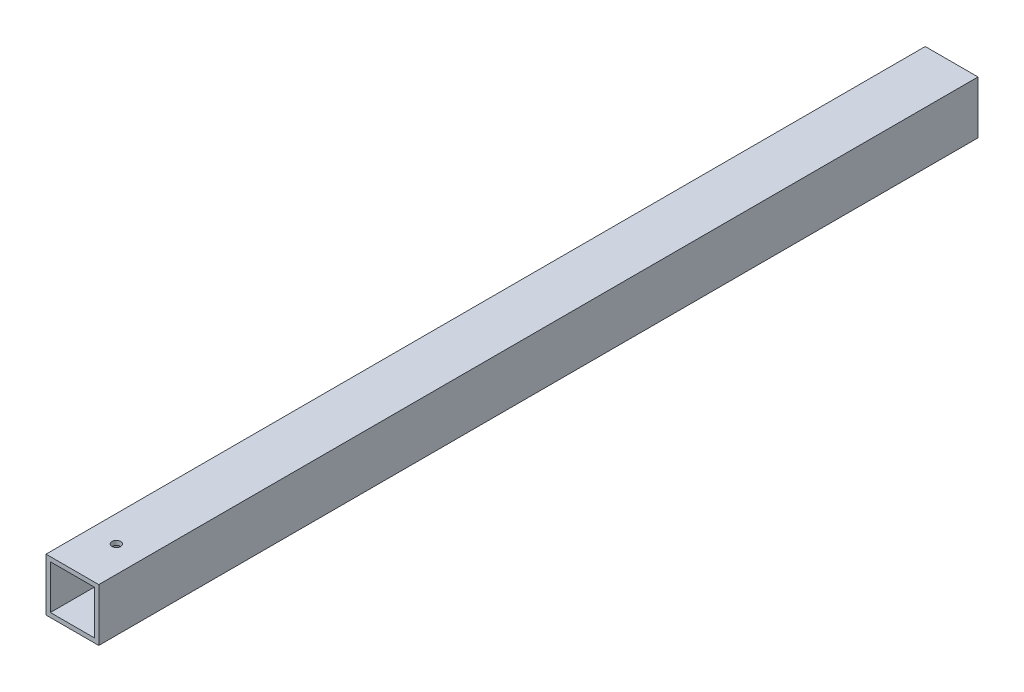
ISO-10303-21;
HEADER;
FILE_DESCRIPTION(('STEP AP214'),'2;1');
FILE_NAME('part.step','',(''),(''),'','','');
FILE_SCHEMA(('AUTOMOTIVE_DESIGN { 1 0 10303 214 1 1 1 1 }'));
ENDSEC;
DATA;
#1=APPLICATION_CONTEXT('core data for automotive mechanical design processes');
#2=APPLICATION_PROTOCOL_DEFINITION('international standard','automotive_design',2000,#1);
#3=PRODUCT_CONTEXT('',#1,'mechanical');
#4=PRODUCT('Part','Part','',(#3));
#5=PRODUCT_RELATED_PRODUCT_CATEGORY('part','',(#4));
#6=PRODUCT_DEFINITION_FORMATION('','',#4);
#7=PRODUCT_DEFINITION_CONTEXT('part definition',#1,'design');
#8=PRODUCT_DEFINITION('design','',#6,#7);
#9=PRODUCT_DEFINITION_SHAPE('','',#8);
#10=(LENGTH_UNIT() NAMED_UNIT(*) SI_UNIT(.MILLI.,.METRE.));
#11=(NAMED_UNIT(*) PLANE_ANGLE_UNIT() SI_UNIT($,.RADIAN.));
#12=(NAMED_UNIT(*) SI_UNIT($,.STERADIAN.) SOLID_ANGLE_UNIT());
#13=UNCERTAINTY_MEASURE_WITH_UNIT(LENGTH_MEASURE(1.E-05),#10,'distance_accuracy_value','');
#14=(GEOMETRIC_REPRESENTATION_CONTEXT(3) GLOBAL_UNCERTAINTY_ASSIGNED_CONTEXT((#13)) GLOBAL_UNIT_ASSIGNED_CONTEXT((#10,
#11,#12)) REPRESENTATION_CONTEXT('',''));
#15=CARTESIAN_POINT('',(0.,0.,0.));
#16=DIRECTION('',(0.,0.,1.));
#17=DIRECTION('',(1.,0.,0.));
#18=AXIS2_PLACEMENT_3D('',#15,#16,#17);
#19=CARTESIAN_POINT('',(0.,0.,200.));
#20=DIRECTION('',(0.,0.,-1.));
#21=DIRECTION('',(-1.,0.,0.));
#22=AXIS2_PLACEMENT_3D('',#19,#20,#21);
#23=PLANE('',#22);
#24=DIRECTION('',(0.,-1.,0.));
#25=VECTOR('',#24,1.);
#26=CARTESIAN_POINT('',(0.,0.,200.));
#27=LINE('',#26,#25);
#28=CARTESIAN_POINT('',(0.,12.,200.));
#29=VERTEX_POINT('',#28);
#30=CARTESIAN_POINT('',(0.,0.,200.));
#31=VERTEX_POINT('',#30);
#32=EDGE_CURVE('E156',#29,#31,#27,.T.);
#33=ORIENTED_EDGE('',*,*,#32,.T.);
#34=DIRECTION('',(1.,0.,0.));
#35=VECTOR('',#34,1.);
#36=CARTESIAN_POINT('',(0.,0.,200.));
#37=LINE('',#36,#35);
#38=CARTESIAN_POINT('',(12.,0.,200.));
#39=VERTEX_POINT('',#38);
#40=EDGE_CURVE('E160',#31,#39,#37,.T.);
#41=ORIENTED_EDGE('',*,*,#40,.T.);
#42=DIRECTION('',(0.,1.,0.));
#43=VECTOR('',#42,1.);
#44=CARTESIAN_POINT('',(12.,0.,200.));
#45=LINE('',#44,#43);
#46=CARTESIAN_POINT('',(12.,12.,200.));
#47=VERTEX_POINT('',#46);
#48=EDGE_CURVE('E164',#39,#47,#45,.T.);
#49=ORIENTED_EDGE('',*,*,#48,.T.);
#50=DIRECTION('',(-1.,0.,0.));
#51=VECTOR('',#50,1.);
#52=CARTESIAN_POINT('',(0.,12.,200.));
#53=LINE('',#52,#51);
#54=EDGE_CURVE('E167',#47,#29,#53,.T.);
#55=ORIENTED_EDGE('',*,*,#54,.T.);
#56=EDGE_LOOP('',(#33,#41,#49,#55));
#57=FACE_BOUND('',#56,.T.);
#58=DIRECTION('',(0.,-1.,0.));
#59=VECTOR('',#58,1.);
#60=CARTESIAN_POINT('',(1.,1.,200.));
#61=LINE('',#60,#59);
#62=CARTESIAN_POINT('',(1.,11.,200.));
#63=VERTEX_POINT('',#62);
#64=CARTESIAN_POINT('',(1.,1.,200.));
#65=VERTEX_POINT('',#64);
#66=EDGE_CURVE('E106',#63,#65,#61,.T.);
#67=ORIENTED_EDGE('',*,*,#66,.F.);
#68=DIRECTION('',(-1.,0.,0.));
#69=VECTOR('',#68,1.);
#70=CARTESIAN_POINT('',(1.,11.,200.));
#71=LINE('',#70,#69);
#72=CARTESIAN_POINT('',(11.,11.,200.));
#73=VERTEX_POINT('',#72);
#74=EDGE_CURVE('E132',#73,#63,#71,.T.);
#75=ORIENTED_EDGE('',*,*,#74,.F.);
#76=DIRECTION('',(0.,1.,0.));
#77=VECTOR('',#76,1.);
#78=CARTESIAN_POINT('',(11.,1.,200.));
#79=LINE('',#78,#77);
#80=CARTESIAN_POINT('',(11.,1.,200.));
#81=VERTEX_POINT('',#80);
#82=EDGE_CURVE('E128',#81,#73,#79,.T.);
#83=ORIENTED_EDGE('',*,*,#82,.F.);
#84=DIRECTION('',(1.,0.,0.));
#85=VECTOR('',#84,1.);
#86=CARTESIAN_POINT('',(1.,1.,200.));
#87=LINE('',#86,#85);
#88=EDGE_CURVE('E115',#65,#81,#87,.T.);
#89=ORIENTED_EDGE('',*,*,#88,.F.);
#90=EDGE_LOOP('',(#67,#75,#83,#89));
#91=FACE_BOUND('',#90,.T.);
#92=ADVANCED_FACE('F39',(#57,#91),#23,.F.);
#93=CARTESIAN_POINT('',(0.,0.,0.));
#94=DIRECTION('',(0.,0.,-1.));
#95=DIRECTION('',(-1.,0.,0.));
#96=AXIS2_PLACEMENT_3D('',#93,#94,#95);
#97=PLANE('',#96);
#98=DIRECTION('',(0.,-1.,0.));
#99=VECTOR('',#98,1.);
#100=CARTESIAN_POINT('',(0.,0.,0.));
#101=LINE('',#100,#99);
#102=CARTESIAN_POINT('',(0.,12.,0.));
#103=VERTEX_POINT('',#102);
#104=CARTESIAN_POINT('',(0.,0.,0.));
#105=VERTEX_POINT('',#104);
#106=EDGE_CURVE('E124',#103,#105,#101,.T.);
#107=ORIENTED_EDGE('',*,*,#106,.F.);
#108=DIRECTION('',(-1.,0.,0.));
#109=VECTOR('',#108,1.);
#110=CARTESIAN_POINT('',(0.,12.,0.));
#111=LINE('',#110,#109);
#112=CARTESIAN_POINT('',(12.,12.,0.));
#113=VERTEX_POINT('',#112);
#114=EDGE_CURVE('E161',#113,#103,#111,.T.);
#115=ORIENTED_EDGE('',*,*,#114,.F.);
#116=DIRECTION('',(0.,1.,0.));
#117=VECTOR('',#116,1.);
#118=CARTESIAN_POINT('',(12.,0.,0.));
#119=LINE('',#118,#117);
#120=CARTESIAN_POINT('',(12.,0.,0.));
#121=VERTEX_POINT('',#120);
#122=EDGE_CURVE('E177',#121,#113,#119,.T.);
#123=ORIENTED_EDGE('',*,*,#122,.F.);
#124=DIRECTION('',(1.,0.,0.));
#125=VECTOR('',#124,1.);
#126=CARTESIAN_POINT('',(0.,0.,0.));
#127=LINE('',#126,#125);
#128=EDGE_CURVE('E174',#105,#121,#127,.T.);
#129=ORIENTED_EDGE('',*,*,#128,.F.);
#130=EDGE_LOOP('',(#107,#115,#123,#129));
#131=FACE_BOUND('',#130,.T.);
#132=DIRECTION('',(-1.,0.,0.));
#133=VECTOR('',#132,1.);
#134=CARTESIAN_POINT('',(1.,11.,0.));
#135=LINE('',#134,#133);
#136=CARTESIAN_POINT('',(11.,11.,0.));
#137=VERTEX_POINT('',#136);
#138=CARTESIAN_POINT('',(1.,11.,0.));
#139=VERTEX_POINT('',#138);
#140=EDGE_CURVE('E116',#137,#139,#135,.T.);
#141=ORIENTED_EDGE('',*,*,#140,.T.);
#142=DIRECTION('',(0.,-1.,0.));
#143=VECTOR('',#142,1.);
#144=CARTESIAN_POINT('',(1.,1.,0.));
#145=LINE('',#144,#143);
#146=CARTESIAN_POINT('',(1.,1.,0.));
#147=VERTEX_POINT('',#146);
#148=EDGE_CURVE('E64',#139,#147,#145,.T.);
#149=ORIENTED_EDGE('',*,*,#148,.T.);
#150=DIRECTION('',(1.,0.,0.));
#151=VECTOR('',#150,1.);
#152=CARTESIAN_POINT('',(1.,1.,0.));
#153=LINE('',#152,#151);
#154=CARTESIAN_POINT('',(11.,1.,0.));
#155=VERTEX_POINT('',#154);
#156=EDGE_CURVE('E122',#147,#155,#153,.T.);
#157=ORIENTED_EDGE('',*,*,#156,.T.);
#158=DIRECTION('',(0.,1.,0.));
#159=VECTOR('',#158,1.);
#160=CARTESIAN_POINT('',(11.,1.,0.));
#161=LINE('',#160,#159);
#162=EDGE_CURVE('E143',#155,#137,#161,.T.);
#163=ORIENTED_EDGE('',*,*,#162,.T.);
#164=EDGE_LOOP('',(#141,#149,#157,#163));
#165=FACE_BOUND('',#164,.T.);
#166=ADVANCED_FACE('F201',(#131,#165),#97,.T.);
#167=CARTESIAN_POINT('',(0.,0.,200.));
#168=DIRECTION('',(1.,0.,0.));
#169=DIRECTION('',(0.,0.,-1.));
#170=AXIS2_PLACEMENT_3D('',#167,#168,#169);
#171=PLANE('',#170);
#172=ORIENTED_EDGE('',*,*,#106,.T.);
#173=DIRECTION('',(0.,0.,-1.));
#174=VECTOR('',#173,1.);
#175=CARTESIAN_POINT('',(0.,0.,200.));
#176=LINE('',#175,#174);
#177=EDGE_CURVE('E11',#31,#105,#176,.T.);
#178=ORIENTED_EDGE('',*,*,#177,.F.);
#179=ORIENTED_EDGE('',*,*,#32,.F.);
#180=DIRECTION('',(0.,0.,-1.));
#181=VECTOR('',#180,1.);
#182=CARTESIAN_POINT('',(0.,12.,200.));
#183=LINE('',#182,#181);
#184=EDGE_CURVE('E170',#29,#103,#183,.T.);
#185=ORIENTED_EDGE('',*,*,#184,.T.);
#186=EDGE_LOOP('',(#172,#178,#179,#185));
#187=FACE_BOUND('',#186,.T.);
#188=ADVANCED_FACE('F41',(#187),#171,.F.);
#189=CARTESIAN_POINT('',(0.,0.,200.));
#190=DIRECTION('',(0.,1.,0.));
#191=DIRECTION('',(0.,0.,1.));
#192=AXIS2_PLACEMENT_3D('',#189,#190,#191);
#193=PLANE('',#192);
#194=CARTESIAN_POINT('',(6.,0.,190.));
#195=DIRECTION('',(0.,-1.,0.));
#196=DIRECTION('',(0.,0.,-1.));
#197=AXIS2_PLACEMENT_3D('',#194,#195,#196);
#198=CIRCLE('',#197,1.);
#199=CARTESIAN_POINT('',(6.,0.,189.));
#200=VERTEX_POINT('',#199);
#201=EDGE_CURVE('E239',#200,#200,#198,.T.);
#202=ORIENTED_EDGE('',*,*,#201,.F.);
#203=EDGE_LOOP('',(#202));
#204=FACE_BOUND('',#203,.T.);
#205=ORIENTED_EDGE('',*,*,#128,.T.);
#206=DIRECTION('',(0.,0.,-1.));
#207=VECTOR('',#206,1.);
#208=CARTESIAN_POINT('',(12.,0.,200.));
#209=LINE('',#208,#207);
#210=EDGE_CURVE('E49',#39,#121,#209,.T.);
#211=ORIENTED_EDGE('',*,*,#210,.F.);
#212=ORIENTED_EDGE('',*,*,#40,.F.);
#213=ORIENTED_EDGE('',*,*,#177,.T.);
#214=EDGE_LOOP('',(#205,#211,#212,#213));
#215=FACE_BOUND('',#214,.T.);
#216=ADVANCED_FACE('F211',(#204,#215),#193,.F.);
#217=CARTESIAN_POINT('',(12.,0.,200.));
#218=DIRECTION('',(-1.,0.,0.));
#219=DIRECTION('',(0.,0.,1.));
#220=AXIS2_PLACEMENT_3D('',#217,#218,#219);
#221=PLANE('',#220);
#222=ORIENTED_EDGE('',*,*,#122,.T.);
#223=DIRECTION('',(0.,0.,-1.));
#224=VECTOR('',#223,1.);
#225=CARTESIAN_POINT('',(12.,12.,200.));
#226=LINE('',#225,#224);
#227=EDGE_CURVE('E185',#47,#113,#226,.T.);
#228=ORIENTED_EDGE('',*,*,#227,.F.);
#229=ORIENTED_EDGE('',*,*,#48,.F.);
#230=ORIENTED_EDGE('',*,*,#210,.T.);
#231=EDGE_LOOP('',(#222,#228,#229,#230));
#232=FACE_BOUND('',#231,.T.);
#233=ADVANCED_FACE('F195',(#232),#221,.F.);
#234=CARTESIAN_POINT('',(0.,12.,200.));
#235=DIRECTION('',(0.,-1.,0.));
#236=DIRECTION('',(0.,0.,-1.));
#237=AXIS2_PLACEMENT_3D('',#234,#235,#236);
#238=PLANE('',#237);
#239=CARTESIAN_POINT('',(6.,12.,190.));
#240=DIRECTION('',(0.,-1.,0.));
#241=DIRECTION('',(0.,0.,-1.));
#242=AXIS2_PLACEMENT_3D('',#239,#240,#241);
#243=CIRCLE('',#242,1.);
#244=CARTESIAN_POINT('',(6.,12.,189.));
#245=VERTEX_POINT('',#244);
#246=EDGE_CURVE('E236',#245,#245,#243,.T.);
#247=ORIENTED_EDGE('',*,*,#246,.T.);
#248=EDGE_LOOP('',(#247));
#249=FACE_BOUND('',#248,.T.);
#250=ORIENTED_EDGE('',*,*,#114,.T.);
#251=ORIENTED_EDGE('',*,*,#184,.F.);
#252=ORIENTED_EDGE('',*,*,#54,.F.);
#253=ORIENTED_EDGE('',*,*,#227,.T.);
#254=EDGE_LOOP('',(#250,#251,#252,#253));
#255=FACE_BOUND('',#254,.T.);
#256=ADVANCED_FACE('F205',(#249,#255),#238,.F.);
#257=CARTESIAN_POINT('',(1.,1.,200.));
#258=DIRECTION('',(1.,0.,0.));
#259=DIRECTION('',(0.,0.,-1.));
#260=AXIS2_PLACEMENT_3D('',#257,#258,#259);
#261=PLANE('',#260);
#262=ORIENTED_EDGE('',*,*,#148,.F.);
#263=DIRECTION('',(0.,0.,-1.));
#264=VECTOR('',#263,1.);
#265=CARTESIAN_POINT('',(1.,11.,200.));
#266=LINE('',#265,#264);
#267=EDGE_CURVE('E110',#63,#139,#266,.T.);
#268=ORIENTED_EDGE('',*,*,#267,.F.);
#269=ORIENTED_EDGE('',*,*,#66,.T.);
#270=DIRECTION('',(0.,0.,-1.));
#271=VECTOR('',#270,1.);
#272=CARTESIAN_POINT('',(1.,1.,200.));
#273=LINE('',#272,#271);
#274=EDGE_CURVE('E109',#65,#147,#273,.T.);
#275=ORIENTED_EDGE('',*,*,#274,.T.);
#276=EDGE_LOOP('',(#262,#268,#269,#275));
#277=FACE_BOUND('',#276,.T.);
#278=ADVANCED_FACE('F108',(#277),#261,.T.);
#279=CARTESIAN_POINT('',(1.,1.,200.));
#280=DIRECTION('',(0.,1.,0.));
#281=DIRECTION('',(0.,0.,1.));
#282=AXIS2_PLACEMENT_3D('',#279,#280,#281);
#283=PLANE('',#282);
#284=CARTESIAN_POINT('',(6.,1.,190.));
#285=DIRECTION('',(0.,1.,0.));
#286=DIRECTION('',(0.,0.,1.));
#287=AXIS2_PLACEMENT_3D('',#284,#285,#286);
#288=CIRCLE('',#287,1.);
#289=CARTESIAN_POINT('',(6.,1.,191.));
#290=VERTEX_POINT('',#289);
#291=EDGE_CURVE('E140',#290,#290,#288,.T.);
#292=ORIENTED_EDGE('',*,*,#291,.F.);
#293=EDGE_LOOP('',(#292));
#294=FACE_BOUND('',#293,.T.);
#295=ORIENTED_EDGE('',*,*,#156,.F.);
#296=ORIENTED_EDGE('',*,*,#274,.F.);
#297=ORIENTED_EDGE('',*,*,#88,.T.);
#298=DIRECTION('',(0.,0.,-1.));
#299=VECTOR('',#298,1.);
#300=CARTESIAN_POINT('',(11.,1.,200.));
#301=LINE('',#300,#299);
#302=EDGE_CURVE('E125',#81,#155,#301,.T.);
#303=ORIENTED_EDGE('',*,*,#302,.T.);
#304=EDGE_LOOP('',(#295,#296,#297,#303));
#305=FACE_BOUND('',#304,.T.);
#306=ADVANCED_FACE('F119',(#294,#305),#283,.T.);
#307=CARTESIAN_POINT('',(11.,1.,200.));
#308=DIRECTION('',(-1.,0.,0.));
#309=DIRECTION('',(0.,0.,1.));
#310=AXIS2_PLACEMENT_3D('',#307,#308,#309);
#311=PLANE('',#310);
#312=ORIENTED_EDGE('',*,*,#162,.F.);
#313=ORIENTED_EDGE('',*,*,#302,.F.);
#314=ORIENTED_EDGE('',*,*,#82,.T.);
#315=DIRECTION('',(0.,0.,-1.));
#316=VECTOR('',#315,1.);
#317=CARTESIAN_POINT('',(11.,11.,200.));
#318=LINE('',#317,#316);
#319=EDGE_CURVE('E56',#73,#137,#318,.T.);
#320=ORIENTED_EDGE('',*,*,#319,.T.);
#321=EDGE_LOOP('',(#312,#313,#314,#320));
#322=FACE_BOUND('',#321,.T.);
#323=ADVANCED_FACE('F254',(#322),#311,.T.);
#324=CARTESIAN_POINT('',(1.,11.,200.));
#325=DIRECTION('',(0.,-1.,0.));
#326=DIRECTION('',(0.,0.,-1.));
#327=AXIS2_PLACEMENT_3D('',#324,#325,#326);
#328=PLANE('',#327);
#329=CARTESIAN_POINT('',(6.,11.,190.));
#330=DIRECTION('',(0.,-1.,0.));
#331=DIRECTION('',(0.,0.,-1.));
#332=AXIS2_PLACEMENT_3D('',#329,#330,#331);
#333=CIRCLE('',#332,1.);
#334=CARTESIAN_POINT('',(6.,11.,189.));
#335=VERTEX_POINT('',#334);
#336=EDGE_CURVE('E43',#335,#335,#333,.T.);
#337=ORIENTED_EDGE('',*,*,#336,.F.);
#338=EDGE_LOOP('',(#337));
#339=FACE_BOUND('',#338,.T.);
#340=ORIENTED_EDGE('',*,*,#140,.F.);
#341=ORIENTED_EDGE('',*,*,#319,.F.);
#342=ORIENTED_EDGE('',*,*,#74,.T.);
#343=ORIENTED_EDGE('',*,*,#267,.T.);
#344=EDGE_LOOP('',(#340,#341,#342,#343));
#345=FACE_BOUND('',#344,.T.);
#346=ADVANCED_FACE('F258',(#339,#345),#328,.T.);
#347=CARTESIAN_POINT('',(6.,12.,190.));
#348=DIRECTION('',(0.,-1.,0.));
#349=DIRECTION('',(0.,0.,-1.));
#350=AXIS2_PLACEMENT_3D('',#347,#348,#349);
#351=CYLINDRICAL_SURFACE('',#350,1.);
#352=ORIENTED_EDGE('',*,*,#336,.T.);
#353=EDGE_LOOP('',(#352));
#354=FACE_BOUND('',#353,.T.);
#355=ORIENTED_EDGE('',*,*,#246,.F.);
#356=EDGE_LOOP('',(#355));
#357=FACE_BOUND('',#356,.T.);
#358=ADVANCED_FACE('F264',(#354,#357),#351,.F.);
#359=ORIENTED_EDGE('',*,*,#291,.T.);
#360=EDGE_LOOP('',(#359));
#361=FACE_BOUND('',#360,.T.);
#362=ORIENTED_EDGE('',*,*,#201,.T.);
#363=EDGE_LOOP('',(#362));
#364=FACE_BOUND('',#363,.T.);
#365=ADVANCED_FACE('F250',(#361,#364),#351,.F.);
#366=CLOSED_SHELL('',(#92,#166,#188,#216,#233,#256,#278,#306,#323,#346,#358,#365));
#367=MANIFOLD_SOLID_BREP('B2',#366);
#368=ADVANCED_BREP_SHAPE_REPRESENTATION('',(#18,#367),#14);
#369=SHAPE_DEFINITION_REPRESENTATION(#9,#368);
ENDSEC;
END-ISO-10303-21;
